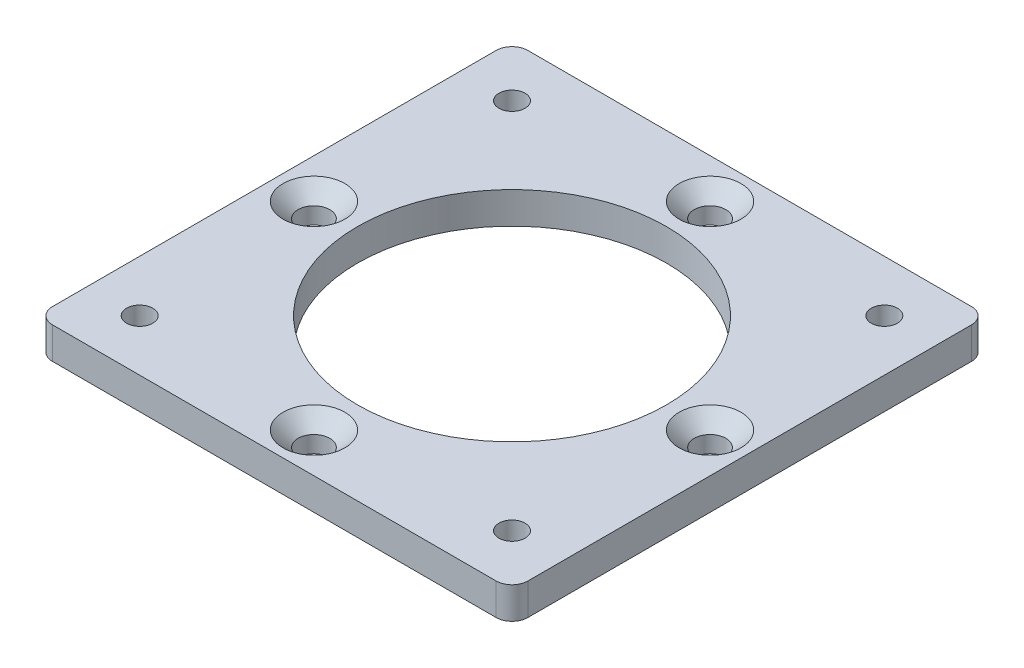
ISO-10303-21;
HEADER;
FILE_DESCRIPTION(('STEP AP214'),'2;1');
FILE_NAME('part.step','',(''),(''),'','','');
FILE_SCHEMA(('AUTOMOTIVE_DESIGN { 1 0 10303 214 1 1 1 1 }'));
ENDSEC;
DATA;
#1=APPLICATION_CONTEXT('core data for automotive mechanical design processes');
#2=APPLICATION_PROTOCOL_DEFINITION('international standard','automotive_design',2000,#1);
#3=PRODUCT_CONTEXT('',#1,'mechanical');
#4=PRODUCT('Part','Part','',(#3));
#5=PRODUCT_RELATED_PRODUCT_CATEGORY('part','',(#4));
#6=PRODUCT_DEFINITION_FORMATION('','',#4);
#7=PRODUCT_DEFINITION_CONTEXT('part definition',#1,'design');
#8=PRODUCT_DEFINITION('design','',#6,#7);
#9=PRODUCT_DEFINITION_SHAPE('','',#8);
#10=(LENGTH_UNIT() NAMED_UNIT(*) SI_UNIT(.MILLI.,.METRE.));
#11=(NAMED_UNIT(*) PLANE_ANGLE_UNIT() SI_UNIT($,.RADIAN.));
#12=(NAMED_UNIT(*) SI_UNIT($,.STERADIAN.) SOLID_ANGLE_UNIT());
#13=UNCERTAINTY_MEASURE_WITH_UNIT(LENGTH_MEASURE(1.E-05),#10,'distance_accuracy_value','');
#14=(GEOMETRIC_REPRESENTATION_CONTEXT(3) GLOBAL_UNCERTAINTY_ASSIGNED_CONTEXT((#13)) GLOBAL_UNIT_ASSIGNED_CONTEXT((#10,
#11,#12)) REPRESENTATION_CONTEXT('',''));
#15=CARTESIAN_POINT('',(0.,0.,0.));
#16=DIRECTION('',(0.,0.,1.));
#17=DIRECTION('',(1.,0.,0.));
#18=AXIS2_PLACEMENT_3D('',#15,#16,#17);
#19=CARTESIAN_POINT('',(-39.0949031250912,4.,26.2189672025911));
#20=DIRECTION('',(0.,1.,0.));
#21=DIRECTION('',(0.,0.,1.));
#22=AXIS2_PLACEMENT_3D('',#19,#20,#21);
#23=PLANE('',#22);
#24=CARTESIAN_POINT('',(-34.0949031250912,4.,-3.78103279740888));
#25=DIRECTION('',(0.,1.,0.));
#26=DIRECTION('',(0.,0.,1.));
#27=AXIS2_PLACEMENT_3D('',#24,#25,#26);
#28=CIRCLE('',#27,3.90000000000001);
#29=CARTESIAN_POINT('',(-34.0949031250912,4.,0.118967202591129));
#30=VERTEX_POINT('',#29);
#31=EDGE_CURVE('E179',#30,#30,#28,.F.);
#32=ORIENTED_EDGE('',*,*,#31,.T.);
#33=EDGE_LOOP('',(#32));
#34=FACE_BOUND('',#33,.T.);
#35=CARTESIAN_POINT('',(15.9050968749088,4.,-3.78103279740888));
#36=DIRECTION('',(0.,1.,0.));
#37=DIRECTION('',(0.,0.,1.));
#38=AXIS2_PLACEMENT_3D('',#35,#36,#37);
#39=CIRCLE('',#38,3.90000000000001);
#40=CARTESIAN_POINT('',(15.9050968749088,4.,0.118967202591129));
#41=VERTEX_POINT('',#40);
#42=EDGE_CURVE('E176',#41,#41,#39,.F.);
#43=ORIENTED_EDGE('',*,*,#42,.T.);
#44=EDGE_LOOP('',(#43));
#45=FACE_BOUND('',#44,.T.);
#46=CARTESIAN_POINT('',(-9.09490312509118,4.,21.2189672025911));
#47=DIRECTION('',(0.,1.,0.));
#48=DIRECTION('',(0.,0.,1.));
#49=AXIS2_PLACEMENT_3D('',#46,#47,#48);
#50=CIRCLE('',#49,3.90000000000001);
#51=CARTESIAN_POINT('',(-9.09490312509118,4.,25.1189672025911));
#52=VERTEX_POINT('',#51);
#53=EDGE_CURVE('E173',#52,#52,#50,.F.);
#54=ORIENTED_EDGE('',*,*,#53,.T.);
#55=EDGE_LOOP('',(#54));
#56=FACE_BOUND('',#55,.T.);
#57=CARTESIAN_POINT('',(-9.09490312509118,4.,-28.7810327974089));
#58=DIRECTION('',(0.,1.,0.));
#59=DIRECTION('',(0.,0.,1.));
#60=AXIS2_PLACEMENT_3D('',#57,#58,#59);
#61=CIRCLE('',#60,3.9);
#62=CARTESIAN_POINT('',(-9.09490312509118,4.,-24.8810327974089));
#63=VERTEX_POINT('',#62);
#64=EDGE_CURVE('E170',#63,#63,#61,.F.);
#65=ORIENTED_EDGE('',*,*,#64,.T.);
#66=EDGE_LOOP('',(#65));
#67=FACE_BOUND('',#66,.T.);
#68=CARTESIAN_POINT('',(14.4050968749088,4.,19.7189672025911));
#69=DIRECTION('',(0.,1.,0.));
#70=DIRECTION('',(0.,0.,1.));
#71=AXIS2_PLACEMENT_3D('',#68,#69,#70);
#72=CIRCLE('',#71,1.65);
#73=CARTESIAN_POINT('',(14.4050968749088,4.,21.3689672025911));
#74=VERTEX_POINT('',#73);
#75=EDGE_CURVE('E276',#74,#74,#72,.T.);
#76=ORIENTED_EDGE('',*,*,#75,.F.);
#77=EDGE_LOOP('',(#76));
#78=FACE_BOUND('',#77,.T.);
#79=CARTESIAN_POINT('',(14.4050968749088,4.,-27.2810327974089));
#80=DIRECTION('',(0.,1.,0.));
#81=DIRECTION('',(0.,0.,1.));
#82=AXIS2_PLACEMENT_3D('',#79,#80,#81);
#83=CIRCLE('',#82,1.65);
#84=CARTESIAN_POINT('',(14.4050968749088,4.,-25.6310327974089));
#85=VERTEX_POINT('',#84);
#86=EDGE_CURVE('E288',#85,#85,#83,.T.);
#87=ORIENTED_EDGE('',*,*,#86,.F.);
#88=EDGE_LOOP('',(#87));
#89=FACE_BOUND('',#88,.T.);
#90=DIRECTION('',(-1.,0.,0.));
#91=VECTOR('',#90,1.);
#92=CARTESIAN_POINT('',(-39.0949031250912,4.,-33.7810327974089));
#93=LINE('',#92,#91);
#94=CARTESIAN_POINT('',(18.9050968749088,4.,-33.7810327974089));
#95=VERTEX_POINT('',#94);
#96=CARTESIAN_POINT('',(-37.0949031250912,4.,-33.7810327974089));
#97=VERTEX_POINT('',#96);
#98=EDGE_CURVE('E137',#95,#97,#93,.T.);
#99=ORIENTED_EDGE('',*,*,#98,.T.);
#100=CARTESIAN_POINT('',(-37.0949031250912,4.,-31.7810327974089));
#101=DIRECTION('',(0.,1.,0.));
#102=DIRECTION('',(0.,0.,1.));
#103=AXIS2_PLACEMENT_3D('',#100,#101,#102);
#104=CIRCLE('',#103,2.);
#105=CARTESIAN_POINT('',(-39.0949031250912,4.,-31.7810327974089));
#106=VERTEX_POINT('',#105);
#107=EDGE_CURVE('E156',#97,#106,#104,.T.);
#108=ORIENTED_EDGE('',*,*,#107,.T.);
#109=DIRECTION('',(0.,0.,1.));
#110=VECTOR('',#109,1.);
#111=CARTESIAN_POINT('',(-39.0949031250912,4.,-33.7810327974089));
#112=LINE('',#111,#110);
#113=CARTESIAN_POINT('',(-39.0949031250912,4.,24.2189672025911));
#114=VERTEX_POINT('',#113);
#115=EDGE_CURVE('E120',#106,#114,#112,.T.);
#116=ORIENTED_EDGE('',*,*,#115,.T.);
#117=CARTESIAN_POINT('',(-37.0949031250912,4.,24.2189672025911));
#118=DIRECTION('',(0.,1.,0.));
#119=DIRECTION('',(0.,0.,1.));
#120=AXIS2_PLACEMENT_3D('',#117,#118,#119);
#121=CIRCLE('',#120,2.);
#122=CARTESIAN_POINT('',(-37.0949031250912,4.,26.2189672025911));
#123=VERTEX_POINT('',#122);
#124=EDGE_CURVE('E151',#114,#123,#121,.T.);
#125=ORIENTED_EDGE('',*,*,#124,.T.);
#126=DIRECTION('',(1.,0.,0.));
#127=VECTOR('',#126,1.);
#128=CARTESIAN_POINT('',(-39.0949031250912,4.,26.2189672025911));
#129=LINE('',#128,#127);
#130=CARTESIAN_POINT('',(18.9050968749088,4.,26.2189672025911));
#131=VERTEX_POINT('',#130);
#132=EDGE_CURVE('E296',#123,#131,#129,.T.);
#133=ORIENTED_EDGE('',*,*,#132,.T.);
#134=CARTESIAN_POINT('',(18.9050968749088,4.,24.2189672025911));
#135=DIRECTION('',(0.,1.,0.));
#136=DIRECTION('',(0.,0.,1.));
#137=AXIS2_PLACEMENT_3D('',#134,#135,#136);
#138=CIRCLE('',#137,2.);
#139=CARTESIAN_POINT('',(20.9050968749088,4.,24.2189672025911));
#140=VERTEX_POINT('',#139);
#141=EDGE_CURVE('E55',#131,#140,#138,.T.);
#142=ORIENTED_EDGE('',*,*,#141,.T.);
#143=DIRECTION('',(0.,0.,-1.));
#144=VECTOR('',#143,1.);
#145=CARTESIAN_POINT('',(20.9050968749088,4.,-33.7810327974089));
#146=LINE('',#145,#144);
#147=CARTESIAN_POINT('',(20.9050968749088,4.,-31.7810327974089));
#148=VERTEX_POINT('',#147);
#149=EDGE_CURVE('E297',#140,#148,#146,.T.);
#150=ORIENTED_EDGE('',*,*,#149,.T.);
#151=CARTESIAN_POINT('',(18.9050968749088,4.,-31.7810327974089));
#152=DIRECTION('',(0.,1.,0.));
#153=DIRECTION('',(0.,0.,1.));
#154=AXIS2_PLACEMENT_3D('',#151,#152,#153);
#155=CIRCLE('',#154,2.);
#156=EDGE_CURVE('E154',#148,#95,#155,.T.);
#157=ORIENTED_EDGE('',*,*,#156,.T.);
#158=EDGE_LOOP('',(#99,#108,#116,#125,#133,#142,#150,#157));
#159=FACE_BOUND('',#158,.T.);
#160=CARTESIAN_POINT('',(-32.5949031250912,4.,-27.2810327974089));
#161=DIRECTION('',(0.,1.,0.));
#162=DIRECTION('',(0.,0.,1.));
#163=AXIS2_PLACEMENT_3D('',#160,#161,#162);
#164=CIRCLE('',#163,1.65);
#165=CARTESIAN_POINT('',(-32.5949031250912,4.,-25.6310327974089));
#166=VERTEX_POINT('',#165);
#167=EDGE_CURVE('E128',#166,#166,#164,.T.);
#168=ORIENTED_EDGE('',*,*,#167,.F.);
#169=EDGE_LOOP('',(#168));
#170=FACE_BOUND('',#169,.T.);
#171=CARTESIAN_POINT('',(-32.5949031250912,4.,19.7189672025911));
#172=DIRECTION('',(0.,1.,0.));
#173=DIRECTION('',(0.,0.,1.));
#174=AXIS2_PLACEMENT_3D('',#171,#172,#173);
#175=CIRCLE('',#174,1.65);
#176=CARTESIAN_POINT('',(-32.5949031250912,4.,21.3689672025911));
#177=VERTEX_POINT('',#176);
#178=EDGE_CURVE('E282',#177,#177,#175,.T.);
#179=ORIENTED_EDGE('',*,*,#178,.F.);
#180=EDGE_LOOP('',(#179));
#181=FACE_BOUND('',#180,.T.);
#182=CARTESIAN_POINT('',(-9.09490312509118,4.,-3.78103279740888));
#183=DIRECTION('',(0.,1.,0.));
#184=DIRECTION('',(0.,0.,1.));
#185=AXIS2_PLACEMENT_3D('',#182,#183,#184);
#186=CIRCLE('',#185,19.5);
#187=CARTESIAN_POINT('',(-9.09490312509118,4.,15.7189672025911));
#188=VERTEX_POINT('',#187);
#189=EDGE_CURVE('E266',#188,#188,#186,.T.);
#190=ORIENTED_EDGE('',*,*,#189,.F.);
#191=EDGE_LOOP('',(#190));
#192=FACE_BOUND('',#191,.T.);
#193=ADVANCED_FACE('F33',(#34,#45,#56,#67,#78,#89,#159,#170,#181,#192),#23,.T.);
#194=CARTESIAN_POINT('',(-39.0949031250912,0.,26.2189672025911));
#195=DIRECTION('',(0.,1.,0.));
#196=DIRECTION('',(0.,0.,1.));
#197=AXIS2_PLACEMENT_3D('',#194,#195,#196);
#198=PLANE('',#197);
#199=CARTESIAN_POINT('',(-9.09490312509118,0.,-28.7810327974089));
#200=DIRECTION('',(0.,1.,0.));
#201=DIRECTION('',(0.,0.,1.));
#202=AXIS2_PLACEMENT_3D('',#199,#200,#201);
#203=CIRCLE('',#202,2.);
#204=CARTESIAN_POINT('',(-9.09490312509118,0.,-26.7810327974089));
#205=VERTEX_POINT('',#204);
#206=EDGE_CURVE('E269',#205,#205,#203,.T.);
#207=ORIENTED_EDGE('',*,*,#206,.T.);
#208=EDGE_LOOP('',(#207));
#209=FACE_BOUND('',#208,.T.);
#210=CARTESIAN_POINT('',(-34.0949031250912,0.,-3.78103279740888));
#211=DIRECTION('',(0.,1.,0.));
#212=DIRECTION('',(0.,0.,1.));
#213=AXIS2_PLACEMENT_3D('',#210,#211,#212);
#214=CIRCLE('',#213,2.);
#215=CARTESIAN_POINT('',(-34.0949031250912,0.,-1.78103279740888));
#216=VERTEX_POINT('',#215);
#217=EDGE_CURVE('E260',#216,#216,#214,.T.);
#218=ORIENTED_EDGE('',*,*,#217,.T.);
#219=EDGE_LOOP('',(#218));
#220=FACE_BOUND('',#219,.T.);
#221=CARTESIAN_POINT('',(14.4050968749088,0.,19.7189672025911));
#222=DIRECTION('',(0.,1.,0.));
#223=DIRECTION('',(0.,0.,1.));
#224=AXIS2_PLACEMENT_3D('',#221,#222,#223);
#225=CIRCLE('',#224,1.65);
#226=CARTESIAN_POINT('',(14.4050968749088,0.,21.3689672025911));
#227=VERTEX_POINT('',#226);
#228=EDGE_CURVE('E274',#227,#227,#225,.T.);
#229=ORIENTED_EDGE('',*,*,#228,.T.);
#230=EDGE_LOOP('',(#229));
#231=FACE_BOUND('',#230,.T.);
#232=CARTESIAN_POINT('',(14.4050968749088,0.,-27.2810327974089));
#233=DIRECTION('',(0.,1.,0.));
#234=DIRECTION('',(0.,0.,1.));
#235=AXIS2_PLACEMENT_3D('',#232,#233,#234);
#236=CIRCLE('',#235,1.65);
#237=CARTESIAN_POINT('',(14.4050968749088,0.,-25.6310327974089));
#238=VERTEX_POINT('',#237);
#239=EDGE_CURVE('E285',#238,#238,#236,.T.);
#240=ORIENTED_EDGE('',*,*,#239,.T.);
#241=EDGE_LOOP('',(#240));
#242=FACE_BOUND('',#241,.T.);
#243=DIRECTION('',(0.,0.,1.));
#244=VECTOR('',#243,1.);
#245=CARTESIAN_POINT('',(-39.0949031250912,0.,-33.7810327974089));
#246=LINE('',#245,#244);
#247=CARTESIAN_POINT('',(-39.0949031250912,0.,-31.7810327974089));
#248=VERTEX_POINT('',#247);
#249=CARTESIAN_POINT('',(-39.0949031250912,0.,24.2189672025911));
#250=VERTEX_POINT('',#249);
#251=EDGE_CURVE('E117',#248,#250,#246,.T.);
#252=ORIENTED_EDGE('',*,*,#251,.F.);
#253=CARTESIAN_POINT('',(-37.0949031250912,0.,-31.7810327974089));
#254=DIRECTION('',(0.,1.,0.));
#255=DIRECTION('',(0.,0.,1.));
#256=AXIS2_PLACEMENT_3D('',#253,#254,#255);
#257=CIRCLE('',#256,2.);
#258=CARTESIAN_POINT('',(-37.0949031250912,0.,-33.7810327974089));
#259=VERTEX_POINT('',#258);
#260=EDGE_CURVE('E100',#248,#259,#257,.F.);
#261=ORIENTED_EDGE('',*,*,#260,.T.);
#262=DIRECTION('',(-1.,0.,0.));
#263=VECTOR('',#262,1.);
#264=CARTESIAN_POINT('',(-39.0949031250912,0.,-33.7810327974089));
#265=LINE('',#264,#263);
#266=CARTESIAN_POINT('',(18.9050968749088,0.,-33.7810327974089));
#267=VERTEX_POINT('',#266);
#268=EDGE_CURVE('E141',#267,#259,#265,.T.);
#269=ORIENTED_EDGE('',*,*,#268,.F.);
#270=CARTESIAN_POINT('',(18.9050968749088,0.,-31.7810327974089));
#271=DIRECTION('',(0.,1.,0.));
#272=DIRECTION('',(0.,0.,1.));
#273=AXIS2_PLACEMENT_3D('',#270,#271,#272);
#274=CIRCLE('',#273,2.);
#275=CARTESIAN_POINT('',(20.9050968749088,0.,-31.7810327974089));
#276=VERTEX_POINT('',#275);
#277=EDGE_CURVE('E111',#267,#276,#274,.F.);
#278=ORIENTED_EDGE('',*,*,#277,.T.);
#279=DIRECTION('',(0.,0.,-1.));
#280=VECTOR('',#279,1.);
#281=CARTESIAN_POINT('',(20.9050968749088,0.,-33.7810327974089));
#282=LINE('',#281,#280);
#283=CARTESIAN_POINT('',(20.9050968749088,0.,24.2189672025911));
#284=VERTEX_POINT('',#283);
#285=EDGE_CURVE('E131',#284,#276,#282,.T.);
#286=ORIENTED_EDGE('',*,*,#285,.F.);
#287=CARTESIAN_POINT('',(18.9050968749088,0.,24.2189672025911));
#288=DIRECTION('',(0.,1.,0.));
#289=DIRECTION('',(0.,0.,1.));
#290=AXIS2_PLACEMENT_3D('',#287,#288,#289);
#291=CIRCLE('',#290,2.);
#292=CARTESIAN_POINT('',(18.9050968749088,0.,26.2189672025911));
#293=VERTEX_POINT('',#292);
#294=EDGE_CURVE('E145',#284,#293,#291,.F.);
#295=ORIENTED_EDGE('',*,*,#294,.T.);
#296=DIRECTION('',(1.,0.,0.));
#297=VECTOR('',#296,1.);
#298=CARTESIAN_POINT('',(-39.0949031250912,0.,26.2189672025911));
#299=LINE('',#298,#297);
#300=CARTESIAN_POINT('',(-37.0949031250912,0.,26.2189672025911));
#301=VERTEX_POINT('',#300);
#302=EDGE_CURVE('E127',#301,#293,#299,.T.);
#303=ORIENTED_EDGE('',*,*,#302,.F.);
#304=CARTESIAN_POINT('',(-37.0949031250912,0.,24.2189672025911));
#305=DIRECTION('',(0.,1.,0.));
#306=DIRECTION('',(0.,0.,1.));
#307=AXIS2_PLACEMENT_3D('',#304,#305,#306);
#308=CIRCLE('',#307,2.);
#309=EDGE_CURVE('E121',#301,#250,#308,.F.);
#310=ORIENTED_EDGE('',*,*,#309,.T.);
#311=EDGE_LOOP('',(#252,#261,#269,#278,#286,#295,#303,#310));
#312=FACE_BOUND('',#311,.T.);
#313=CARTESIAN_POINT('',(-32.5949031250912,0.,-27.2810327974089));
#314=DIRECTION('',(0.,1.,0.));
#315=DIRECTION('',(0.,0.,1.));
#316=AXIS2_PLACEMENT_3D('',#313,#314,#315);
#317=CIRCLE('',#316,1.65);
#318=CARTESIAN_POINT('',(-32.5949031250912,0.,-25.6310327974089));
#319=VERTEX_POINT('',#318);
#320=EDGE_CURVE('E134',#319,#319,#317,.T.);
#321=ORIENTED_EDGE('',*,*,#320,.T.);
#322=EDGE_LOOP('',(#321));
#323=FACE_BOUND('',#322,.T.);
#324=CARTESIAN_POINT('',(-32.5949031250912,0.,19.7189672025911));
#325=DIRECTION('',(0.,1.,0.));
#326=DIRECTION('',(0.,0.,1.));
#327=AXIS2_PLACEMENT_3D('',#324,#325,#326);
#328=CIRCLE('',#327,1.65);
#329=CARTESIAN_POINT('',(-32.5949031250912,0.,21.3689672025911));
#330=VERTEX_POINT('',#329);
#331=EDGE_CURVE('E279',#330,#330,#328,.T.);
#332=ORIENTED_EDGE('',*,*,#331,.T.);
#333=EDGE_LOOP('',(#332));
#334=FACE_BOUND('',#333,.T.);
#335=CARTESIAN_POINT('',(-9.09490312509118,0.,-3.78103279740888));
#336=DIRECTION('',(0.,1.,0.));
#337=DIRECTION('',(0.,0.,1.));
#338=AXIS2_PLACEMENT_3D('',#335,#336,#337);
#339=CIRCLE('',#338,19.5);
#340=CARTESIAN_POINT('',(-9.09490312509118,0.,15.7189672025911));
#341=VERTEX_POINT('',#340);
#342=EDGE_CURVE('E262',#341,#341,#339,.T.);
#343=ORIENTED_EDGE('',*,*,#342,.T.);
#344=EDGE_LOOP('',(#343));
#345=FACE_BOUND('',#344,.T.);
#346=CARTESIAN_POINT('',(15.9050968749088,0.,-3.78103279740888));
#347=DIRECTION('',(0.,1.,0.));
#348=DIRECTION('',(0.,0.,1.));
#349=AXIS2_PLACEMENT_3D('',#346,#347,#348);
#350=CIRCLE('',#349,2.);
#351=CARTESIAN_POINT('',(15.9050968749088,0.,-1.78103279740888));
#352=VERTEX_POINT('',#351);
#353=EDGE_CURVE('E263',#352,#352,#350,.T.);
#354=ORIENTED_EDGE('',*,*,#353,.T.);
#355=EDGE_LOOP('',(#354));
#356=FACE_BOUND('',#355,.T.);
#357=CARTESIAN_POINT('',(-9.09490312509118,0.,21.2189672025911));
#358=DIRECTION('',(0.,1.,0.));
#359=DIRECTION('',(0.,0.,1.));
#360=AXIS2_PLACEMENT_3D('',#357,#358,#359);
#361=CIRCLE('',#360,2.);
#362=CARTESIAN_POINT('',(-9.09490312509118,0.,23.2189672025911));
#363=VERTEX_POINT('',#362);
#364=EDGE_CURVE('E326',#363,#363,#361,.T.);
#365=ORIENTED_EDGE('',*,*,#364,.T.);
#366=EDGE_LOOP('',(#365));
#367=FACE_BOUND('',#366,.T.);
#368=ADVANCED_FACE('F124',(#209,#220,#231,#242,#312,#323,#334,#345,#356,#367),#198,.F.);
#369=CARTESIAN_POINT('',(-39.0949031250912,4.,-33.7810327974089));
#370=DIRECTION('',(1.,0.,0.));
#371=DIRECTION('',(0.,0.,-1.));
#372=AXIS2_PLACEMENT_3D('',#369,#370,#371);
#373=PLANE('',#372);
#374=ORIENTED_EDGE('',*,*,#115,.F.);
#375=DIRECTION('',(0.,-1.,0.));
#376=VECTOR('',#375,1.);
#377=CARTESIAN_POINT('',(-39.0949031250912,4.,-31.7810327974089));
#378=LINE('',#377,#376);
#379=EDGE_CURVE('E104',#106,#248,#378,.T.);
#380=ORIENTED_EDGE('',*,*,#379,.T.);
#381=ORIENTED_EDGE('',*,*,#251,.T.);
#382=DIRECTION('',(0.,-1.,0.));
#383=VECTOR('',#382,1.);
#384=CARTESIAN_POINT('',(-39.0949031250912,4.,24.2189672025911));
#385=LINE('',#384,#383);
#386=EDGE_CURVE('E122',#250,#114,#385,.F.);
#387=ORIENTED_EDGE('',*,*,#386,.T.);
#388=EDGE_LOOP('',(#374,#380,#381,#387));
#389=FACE_BOUND('',#388,.T.);
#390=ADVANCED_FACE('F116',(#389),#373,.F.);
#391=CARTESIAN_POINT('',(-39.0949031250912,4.,26.2189672025911));
#392=DIRECTION('',(0.,0.,-1.));
#393=DIRECTION('',(-1.,0.,0.));
#394=AXIS2_PLACEMENT_3D('',#391,#392,#393);
#395=PLANE('',#394);
#396=ORIENTED_EDGE('',*,*,#302,.T.);
#397=DIRECTION('',(0.,-1.,0.));
#398=VECTOR('',#397,1.);
#399=CARTESIAN_POINT('',(18.9050968749088,4.,26.2189672025911));
#400=LINE('',#399,#398);
#401=EDGE_CURVE('E165',#293,#131,#400,.F.);
#402=ORIENTED_EDGE('',*,*,#401,.T.);
#403=ORIENTED_EDGE('',*,*,#132,.F.);
#404=DIRECTION('',(0.,-1.,0.));
#405=VECTOR('',#404,1.);
#406=CARTESIAN_POINT('',(-37.0949031250912,4.,26.2189672025911));
#407=LINE('',#406,#405);
#408=EDGE_CURVE('E162',#123,#301,#407,.T.);
#409=ORIENTED_EDGE('',*,*,#408,.T.);
#410=EDGE_LOOP('',(#396,#402,#403,#409));
#411=FACE_BOUND('',#410,.T.);
#412=ADVANCED_FACE('F225',(#411),#395,.F.);
#413=CARTESIAN_POINT('',(20.9050968749088,4.,-33.7810327974089));
#414=DIRECTION('',(-1.,0.,0.));
#415=DIRECTION('',(0.,0.,1.));
#416=AXIS2_PLACEMENT_3D('',#413,#414,#415);
#417=PLANE('',#416);
#418=ORIENTED_EDGE('',*,*,#285,.T.);
#419=DIRECTION('',(0.,-1.,0.));
#420=VECTOR('',#419,1.);
#421=CARTESIAN_POINT('',(20.9050968749088,4.,-31.7810327974089));
#422=LINE('',#421,#420);
#423=EDGE_CURVE('E48',#276,#148,#422,.F.);
#424=ORIENTED_EDGE('',*,*,#423,.T.);
#425=ORIENTED_EDGE('',*,*,#149,.F.);
#426=DIRECTION('',(0.,-1.,0.));
#427=VECTOR('',#426,1.);
#428=CARTESIAN_POINT('',(20.9050968749088,4.,24.2189672025911));
#429=LINE('',#428,#427);
#430=EDGE_CURVE('E158',#140,#284,#429,.T.);
#431=ORIENTED_EDGE('',*,*,#430,.T.);
#432=EDGE_LOOP('',(#418,#424,#425,#431));
#433=FACE_BOUND('',#432,.T.);
#434=ADVANCED_FACE('F221',(#433),#417,.F.);
#435=CARTESIAN_POINT('',(-39.0949031250912,4.,-33.7810327974089));
#436=DIRECTION('',(0.,0.,1.));
#437=DIRECTION('',(1.,0.,0.));
#438=AXIS2_PLACEMENT_3D('',#435,#436,#437);
#439=PLANE('',#438);
#440=ORIENTED_EDGE('',*,*,#268,.T.);
#441=DIRECTION('',(0.,-1.,0.));
#442=VECTOR('',#441,1.);
#443=CARTESIAN_POINT('',(-37.0949031250912,4.,-33.7810327974089));
#444=LINE('',#443,#442);
#445=EDGE_CURVE('E105',#259,#97,#444,.F.);
#446=ORIENTED_EDGE('',*,*,#445,.T.);
#447=ORIENTED_EDGE('',*,*,#98,.F.);
#448=DIRECTION('',(0.,-1.,0.));
#449=VECTOR('',#448,1.);
#450=CARTESIAN_POINT('',(18.9050968749088,4.,-33.7810327974089));
#451=LINE('',#450,#449);
#452=EDGE_CURVE('E110',#95,#267,#451,.T.);
#453=ORIENTED_EDGE('',*,*,#452,.T.);
#454=EDGE_LOOP('',(#440,#446,#447,#453));
#455=FACE_BOUND('',#454,.T.);
#456=ADVANCED_FACE('F218',(#455),#439,.F.);
#457=CARTESIAN_POINT('',(-32.5949031250912,4.,-27.2810327974089));
#458=DIRECTION('',(0.,-1.,0.));
#459=DIRECTION('',(0.,0.,-1.));
#460=AXIS2_PLACEMENT_3D('',#457,#458,#459);
#461=CYLINDRICAL_SURFACE('',#460,1.65);
#462=ORIENTED_EDGE('',*,*,#167,.T.);
#463=EDGE_LOOP('',(#462));
#464=FACE_BOUND('',#463,.T.);
#465=ORIENTED_EDGE('',*,*,#320,.F.);
#466=EDGE_LOOP('',(#465));
#467=FACE_BOUND('',#466,.T.);
#468=ADVANCED_FACE('F215',(#464,#467),#461,.F.);
#469=CARTESIAN_POINT('',(14.4050968749088,4.,-27.2810327974089));
#470=DIRECTION('',(0.,-1.,0.));
#471=DIRECTION('',(0.,0.,-1.));
#472=AXIS2_PLACEMENT_3D('',#469,#470,#471);
#473=CYLINDRICAL_SURFACE('',#472,1.65);
#474=ORIENTED_EDGE('',*,*,#86,.T.);
#475=EDGE_LOOP('',(#474));
#476=FACE_BOUND('',#475,.T.);
#477=ORIENTED_EDGE('',*,*,#239,.F.);
#478=EDGE_LOOP('',(#477));
#479=FACE_BOUND('',#478,.T.);
#480=ADVANCED_FACE('F348',(#476,#479),#473,.F.);
#481=CARTESIAN_POINT('',(-32.5949031250912,4.,19.7189672025911));
#482=DIRECTION('',(0.,-1.,0.));
#483=DIRECTION('',(0.,0.,-1.));
#484=AXIS2_PLACEMENT_3D('',#481,#482,#483);
#485=CYLINDRICAL_SURFACE('',#484,1.65);
#486=ORIENTED_EDGE('',*,*,#178,.T.);
#487=EDGE_LOOP('',(#486));
#488=FACE_BOUND('',#487,.T.);
#489=ORIENTED_EDGE('',*,*,#331,.F.);
#490=EDGE_LOOP('',(#489));
#491=FACE_BOUND('',#490,.T.);
#492=ADVANCED_FACE('F345',(#488,#491),#485,.F.);
#493=CARTESIAN_POINT('',(14.4050968749088,4.,19.7189672025911));
#494=DIRECTION('',(0.,-1.,0.));
#495=DIRECTION('',(0.,0.,-1.));
#496=AXIS2_PLACEMENT_3D('',#493,#494,#495);
#497=CYLINDRICAL_SURFACE('',#496,1.65);
#498=ORIENTED_EDGE('',*,*,#75,.T.);
#499=EDGE_LOOP('',(#498));
#500=FACE_BOUND('',#499,.T.);
#501=ORIENTED_EDGE('',*,*,#228,.F.);
#502=EDGE_LOOP('',(#501));
#503=FACE_BOUND('',#502,.T.);
#504=ADVANCED_FACE('F317',(#500,#503),#497,.F.);
#505=CARTESIAN_POINT('',(-9.09490312509118,4.,-3.78103279740888));
#506=DIRECTION('',(0.,-1.,0.));
#507=DIRECTION('',(0.,0.,-1.));
#508=AXIS2_PLACEMENT_3D('',#505,#506,#507);
#509=CYLINDRICAL_SURFACE('',#508,19.5);
#510=ORIENTED_EDGE('',*,*,#189,.T.);
#511=EDGE_LOOP('',(#510));
#512=FACE_BOUND('',#511,.T.);
#513=ORIENTED_EDGE('',*,*,#342,.F.);
#514=EDGE_LOOP('',(#513));
#515=FACE_BOUND('',#514,.T.);
#516=ADVANCED_FACE('F256',(#512,#515),#509,.F.);
#517=CARTESIAN_POINT('',(-34.0949031250912,4.,-3.78103279740888));
#518=DIRECTION('',(0.,-1.,0.));
#519=DIRECTION('',(0.,0.,-1.));
#520=AXIS2_PLACEMENT_3D('',#517,#518,#519);
#521=CYLINDRICAL_SURFACE('',#520,2.);
#522=CARTESIAN_POINT('',(-34.0949031250912,2.09999999999999,-3.78103279740888));
#523=DIRECTION('',(0.,1.,0.));
#524=DIRECTION('',(0.,0.,1.));
#525=AXIS2_PLACEMENT_3D('',#522,#523,#524);
#526=CIRCLE('',#525,2.);
#527=CARTESIAN_POINT('',(-34.0949031250912,2.09999999999999,-1.78103279740888));
#528=VERTEX_POINT('',#527);
#529=EDGE_CURVE('E167',#528,#528,#526,.T.);
#530=ORIENTED_EDGE('',*,*,#529,.T.);
#531=EDGE_LOOP('',(#530));
#532=FACE_BOUND('',#531,.T.);
#533=ORIENTED_EDGE('',*,*,#217,.F.);
#534=EDGE_LOOP('',(#533));
#535=FACE_BOUND('',#534,.T.);
#536=ADVANCED_FACE('F253',(#532,#535),#521,.F.);
#537=CARTESIAN_POINT('',(15.9050968749088,4.,-3.78103279740888));
#538=DIRECTION('',(0.,-1.,0.));
#539=DIRECTION('',(0.,0.,-1.));
#540=AXIS2_PLACEMENT_3D('',#537,#538,#539);
#541=CYLINDRICAL_SURFACE('',#540,2.);
#542=CARTESIAN_POINT('',(15.9050968749088,2.09999999999999,-3.78103279740888));
#543=DIRECTION('',(0.,1.,0.));
#544=DIRECTION('',(0.,0.,1.));
#545=AXIS2_PLACEMENT_3D('',#542,#543,#544);
#546=CIRCLE('',#545,2.);
#547=CARTESIAN_POINT('',(15.9050968749088,2.09999999999999,-1.78103279740888));
#548=VERTEX_POINT('',#547);
#549=EDGE_CURVE('E182',#548,#548,#546,.T.);
#550=ORIENTED_EDGE('',*,*,#549,.T.);
#551=EDGE_LOOP('',(#550));
#552=FACE_BOUND('',#551,.T.);
#553=ORIENTED_EDGE('',*,*,#353,.F.);
#554=EDGE_LOOP('',(#553));
#555=FACE_BOUND('',#554,.T.);
#556=ADVANCED_FACE('F255',(#552,#555),#541,.F.);
#557=CARTESIAN_POINT('',(-9.09490312509118,4.,-28.7810327974089));
#558=DIRECTION('',(0.,-1.,0.));
#559=DIRECTION('',(0.,0.,-1.));
#560=AXIS2_PLACEMENT_3D('',#557,#558,#559);
#561=CYLINDRICAL_SURFACE('',#560,2.);
#562=CARTESIAN_POINT('',(-9.09490312509118,2.09999999999999,-28.7810327974089));
#563=DIRECTION('',(0.,1.,0.));
#564=DIRECTION('',(0.,0.,1.));
#565=AXIS2_PLACEMENT_3D('',#562,#563,#564);
#566=CIRCLE('',#565,2.);
#567=CARTESIAN_POINT('',(-9.09490312509118,2.09999999999999,-26.7810327974089));
#568=VERTEX_POINT('',#567);
#569=EDGE_CURVE('E11',#568,#568,#566,.T.);
#570=ORIENTED_EDGE('',*,*,#569,.T.);
#571=EDGE_LOOP('',(#570));
#572=FACE_BOUND('',#571,.T.);
#573=ORIENTED_EDGE('',*,*,#206,.F.);
#574=EDGE_LOOP('',(#573));
#575=FACE_BOUND('',#574,.T.);
#576=ADVANCED_FACE('F331',(#572,#575),#561,.F.);
#577=CARTESIAN_POINT('',(-9.09490312509118,4.,21.2189672025911));
#578=DIRECTION('',(0.,-1.,0.));
#579=DIRECTION('',(0.,0.,-1.));
#580=AXIS2_PLACEMENT_3D('',#577,#578,#579);
#581=CYLINDRICAL_SURFACE('',#580,2.);
#582=CARTESIAN_POINT('',(-9.09490312509118,2.09999999999999,21.2189672025911));
#583=DIRECTION('',(0.,1.,0.));
#584=DIRECTION('',(0.,0.,1.));
#585=AXIS2_PLACEMENT_3D('',#582,#583,#584);
#586=CIRCLE('',#585,2.);
#587=CARTESIAN_POINT('',(-9.09490312509118,2.09999999999999,23.2189672025911));
#588=VERTEX_POINT('',#587);
#589=EDGE_CURVE('E41',#588,#588,#586,.T.);
#590=ORIENTED_EDGE('',*,*,#589,.T.);
#591=EDGE_LOOP('',(#590));
#592=FACE_BOUND('',#591,.T.);
#593=ORIENTED_EDGE('',*,*,#364,.F.);
#594=EDGE_LOOP('',(#593));
#595=FACE_BOUND('',#594,.T.);
#596=ADVANCED_FACE('F187',(#592,#595),#581,.F.);
#597=CARTESIAN_POINT('',(-37.0949031250912,4.,-31.7810327974089));
#598=DIRECTION('',(0.,-1.,0.));
#599=DIRECTION('',(0.,0.,-1.));
#600=AXIS2_PLACEMENT_3D('',#597,#598,#599);
#601=CYLINDRICAL_SURFACE('',#600,2.);
#602=ORIENTED_EDGE('',*,*,#107,.F.);
#603=ORIENTED_EDGE('',*,*,#445,.F.);
#604=ORIENTED_EDGE('',*,*,#260,.F.);
#605=ORIENTED_EDGE('',*,*,#379,.F.);
#606=EDGE_LOOP('',(#602,#603,#604,#605));
#607=FACE_BOUND('',#606,.T.);
#608=ADVANCED_FACE('F103',(#607),#601,.T.);
#609=CARTESIAN_POINT('',(18.9050968749088,4.,-31.7810327974089));
#610=DIRECTION('',(0.,-1.,0.));
#611=DIRECTION('',(0.,0.,-1.));
#612=AXIS2_PLACEMENT_3D('',#609,#610,#611);
#613=CYLINDRICAL_SURFACE('',#612,2.);
#614=ORIENTED_EDGE('',*,*,#156,.F.);
#615=ORIENTED_EDGE('',*,*,#423,.F.);
#616=ORIENTED_EDGE('',*,*,#277,.F.);
#617=ORIENTED_EDGE('',*,*,#452,.F.);
#618=EDGE_LOOP('',(#614,#615,#616,#617));
#619=FACE_BOUND('',#618,.T.);
#620=ADVANCED_FACE('F233',(#619),#613,.T.);
#621=CARTESIAN_POINT('',(18.9050968749088,4.,24.2189672025911));
#622=DIRECTION('',(0.,-1.,0.));
#623=DIRECTION('',(0.,0.,-1.));
#624=AXIS2_PLACEMENT_3D('',#621,#622,#623);
#625=CYLINDRICAL_SURFACE('',#624,2.);
#626=ORIENTED_EDGE('',*,*,#141,.F.);
#627=ORIENTED_EDGE('',*,*,#401,.F.);
#628=ORIENTED_EDGE('',*,*,#294,.F.);
#629=ORIENTED_EDGE('',*,*,#430,.F.);
#630=EDGE_LOOP('',(#626,#627,#628,#629));
#631=FACE_BOUND('',#630,.T.);
#632=ADVANCED_FACE('F236',(#631),#625,.T.);
#633=CARTESIAN_POINT('',(-37.0949031250912,4.,24.2189672025911));
#634=DIRECTION('',(0.,-1.,0.));
#635=DIRECTION('',(0.,0.,-1.));
#636=AXIS2_PLACEMENT_3D('',#633,#634,#635);
#637=CYLINDRICAL_SURFACE('',#636,2.);
#638=ORIENTED_EDGE('',*,*,#124,.F.);
#639=ORIENTED_EDGE('',*,*,#386,.F.);
#640=ORIENTED_EDGE('',*,*,#309,.F.);
#641=ORIENTED_EDGE('',*,*,#408,.F.);
#642=EDGE_LOOP('',(#638,#639,#640,#641));
#643=FACE_BOUND('',#642,.T.);
#644=ADVANCED_FACE('F240',(#643),#637,.T.);
#645=CARTESIAN_POINT('',(-34.0949031250912,2.09999999999999,-3.78103279740888));
#646=DIRECTION('',(0.,1.,0.));
#647=DIRECTION('',(0.,0.,1.));
#648=AXIS2_PLACEMENT_3D('',#645,#646,#647);
#649=CONICAL_SURFACE('',#648,2.,0.785398163397446);
#650=CARTESIAN_POINT('',(-34.0949031250912,4.,0.118967202591129));
#651=CARTESIAN_POINT('',(-34.0949031250912,3.98020833333333,0.0991755359244619));
#652=CARTESIAN_POINT('',(-34.0949031250912,3.96041666666667,0.0793838692577953));
#653=CARTESIAN_POINT('',(-34.0949031250912,3.92083333333333,0.0398005359244618));
#654=CARTESIAN_POINT('',(-34.0949031250912,3.90104166666667,0.020008869257795));
#655=CARTESIAN_POINT('',(-34.0949031250912,3.86145833333333,-0.0195744640755386));
#656=CARTESIAN_POINT('',(-34.0949031250912,3.84166666666666,-0.0393661307422055));
#657=CARTESIAN_POINT('',(-34.0949031250912,3.80208333333333,-0.0789494640755388));
#658=CARTESIAN_POINT('',(-34.0949031250912,3.78229166666666,-0.0987411307422052));
#659=CARTESIAN_POINT('',(-34.0949031250912,3.74270833333333,-0.138324464075539));
#660=CARTESIAN_POINT('',(-34.0949031250912,3.72291666666666,-0.158116130742205));
#661=CARTESIAN_POINT('',(-34.0949031250912,3.68333333333333,-0.197699464075539));
#662=CARTESIAN_POINT('',(-34.0949031250912,3.66354166666666,-0.217491130742206));
#663=CARTESIAN_POINT('',(-34.0949031250912,3.62395833333333,-0.257074464075539));
#664=CARTESIAN_POINT('',(-34.0949031250912,3.60416666666666,-0.276866130742206));
#665=CARTESIAN_POINT('',(-34.0949031250912,3.56458333333333,-0.316449464075539));
#666=CARTESIAN_POINT('',(-34.0949031250912,3.54479166666666,-0.336241130742206));
#667=CARTESIAN_POINT('',(-34.0949031250912,3.50520833333333,-0.375824464075539));
#668=CARTESIAN_POINT('',(-34.0949031250912,3.48541666666666,-0.395616130742206));
#669=CARTESIAN_POINT('',(-34.0949031250912,3.44583333333333,-0.435199464075539));
#670=CARTESIAN_POINT('',(-34.0949031250912,3.42604166666666,-0.454991130742206));
#671=CARTESIAN_POINT('',(-34.0949031250912,3.38645833333333,-0.494574464075539));
#672=CARTESIAN_POINT('',(-34.0949031250912,3.36666666666666,-0.514366130742206));
#673=CARTESIAN_POINT('',(-34.0949031250912,3.32708333333333,-0.55394946407554));
#674=CARTESIAN_POINT('',(-34.0949031250912,3.30729166666666,-0.573741130742206));
#675=CARTESIAN_POINT('',(-34.0949031250912,3.26770833333333,-0.61332446407554));
#676=CARTESIAN_POINT('',(-34.0949031250912,3.24791666666666,-0.633116130742207));
#677=CARTESIAN_POINT('',(-34.0949031250912,3.20833333333333,-0.67269946407554));
#678=CARTESIAN_POINT('',(-34.0949031250912,3.18854166666666,-0.692491130742206));
#679=CARTESIAN_POINT('',(-34.0949031250912,3.14895833333333,-0.73207446407554));
#680=CARTESIAN_POINT('',(-34.0949031250912,3.12916666666666,-0.751866130742207));
#681=CARTESIAN_POINT('',(-34.0949031250912,3.08958333333333,-0.79144946407554));
#682=CARTESIAN_POINT('',(-34.0949031250912,3.06979166666666,-0.811241130742207));
#683=CARTESIAN_POINT('',(-34.0949031250912,3.03020833333333,-0.85082446407554));
#684=CARTESIAN_POINT('',(-34.0949031250912,3.01041666666666,-0.870616130742207));
#685=CARTESIAN_POINT('',(-34.0949031250912,2.97083333333333,-0.91019946407554));
#686=CARTESIAN_POINT('',(-34.0949031250912,2.95104166666666,-0.929991130742207));
#687=CARTESIAN_POINT('',(-34.0949031250912,2.91145833333333,-0.969574464075541));
#688=CARTESIAN_POINT('',(-34.0949031250912,2.89166666666666,-0.989366130742208));
#689=CARTESIAN_POINT('',(-34.0949031250912,2.85208333333333,-1.02894946407554));
#690=CARTESIAN_POINT('',(-34.0949031250912,2.83229166666666,-1.04874113074221));
#691=CARTESIAN_POINT('',(-34.0949031250912,2.79270833333333,-1.08832446407554));
#692=CARTESIAN_POINT('',(-34.0949031250912,2.77291666666666,-1.10811613074221));
#693=CARTESIAN_POINT('',(-34.0949031250912,2.73333333333332,-1.14769946407554));
#694=CARTESIAN_POINT('',(-34.0949031250912,2.71354166666666,-1.16749113074221));
#695=CARTESIAN_POINT('',(-34.0949031250912,2.67395833333332,-1.20707446407554));
#696=CARTESIAN_POINT('',(-34.0949031250912,2.65416666666666,-1.22686613074221));
#697=CARTESIAN_POINT('',(-34.0949031250912,2.61458333333332,-1.26644946407554));
#698=CARTESIAN_POINT('',(-34.0949031250912,2.59479166666666,-1.28624113074221));
#699=CARTESIAN_POINT('',(-34.0949031250912,2.55520833333332,-1.32582446407554));
#700=CARTESIAN_POINT('',(-34.0949031250912,2.53541666666666,-1.34561613074221));
#701=CARTESIAN_POINT('',(-34.0949031250912,2.49583333333332,-1.38519946407554));
#702=CARTESIAN_POINT('',(-34.0949031250912,2.47604166666666,-1.40499113074221));
#703=CARTESIAN_POINT('',(-34.0949031250912,2.43645833333332,-1.44457446407554));
#704=CARTESIAN_POINT('',(-34.0949031250912,2.41666666666666,-1.46436613074221));
#705=CARTESIAN_POINT('',(-34.0949031250912,2.37708333333332,-1.50394946407554));
#706=CARTESIAN_POINT('',(-34.0949031250912,2.35729166666666,-1.52374113074221));
#707=CARTESIAN_POINT('',(-34.0949031250912,2.31770833333332,-1.56332446407554));
#708=CARTESIAN_POINT('',(-34.0949031250912,2.29791666666666,-1.58311613074221));
#709=CARTESIAN_POINT('',(-34.0949031250912,2.25833333333332,-1.62269946407554));
#710=CARTESIAN_POINT('',(-34.0949031250912,2.23854166666666,-1.64249113074221));
#711=CARTESIAN_POINT('',(-34.0949031250912,2.19895833333332,-1.68207446407554));
#712=CARTESIAN_POINT('',(-34.0949031250912,2.17916666666665,-1.70186613074221));
#713=CARTESIAN_POINT('',(-34.0949031250912,2.13958333333332,-1.74144946407554));
#714=CARTESIAN_POINT('',(-34.0949031250912,2.11979166666665,-1.76124113074221));
#715=CARTESIAN_POINT('',(-34.0949031250912,2.09999999999999,-1.78103279740888));
#716=B_SPLINE_CURVE_WITH_KNOTS('',3,(#650,#651,#652,#653,#654,#655,#656,#657,#658,#659,#660,
#661,#662,#663,#664,#665,#666,#667,#668,#669,#670,#671,#672,#673,#674,#675,#676,#677,#678,#679,
#680,#681,#682,#683,#684,#685,#686,#687,#688,#689,#690,#691,#692,#693,#694,#695,#696,#697,#698,
#699,#700,#701,#702,#703,#704,#705,#706,#707,#708,#709,#710,#711,#712,#713,#714,#715),
.UNSPECIFIED.,.F.,.F.,(4,2,2,2,2,2,2,2,2,2,2,2,2,2,2,2,2,2,2,2,2,2,2,2,2,2,2,2,2,2,2,2,4),(0.,
0.0839689302659028,0.167937860531806,0.251906790797709,0.335875721063611,0.419844651329514,
0.503813581595417,0.58778251186132,0.671751442127223,0.755720372393125,0.839689302659028,
0.923658232924931,1.00762716319083,1.09159609345674,1.17556502372264,1.25953395398854,
1.34350288425445,1.42747181452035,1.51144074478625,1.59540967505215,1.67937860531806,
1.76334753558396,1.84731646584986,1.93128539611577,2.01525432638167,2.09922325664757,
2.18319218691347,2.26716111717938,2.35113004744528,2.43509897771118,2.51906790797709,
2.60303683824299,2.68700576850889),.UNSPECIFIED.);
#717=EDGE_CURVE('BSEAM199',#30,#528,#716,.T.);
#718=ORIENTED_EDGE('',*,*,#31,.F.);
#719=ORIENTED_EDGE('',*,*,#529,.F.);
#720=ORIENTED_EDGE('',*,*,#717,.T.);
#721=ORIENTED_EDGE('',*,*,#717,.F.);
#722=EDGE_LOOP('',(#718,#720,#719,#721));
#723=FACE_BOUND('',#722,.T.);
#724=ADVANCED_FACE('F199',(#723),#649,.F.);
#725=CARTESIAN_POINT('',(15.9050968749088,2.09999999999999,-3.78103279740888));
#726=DIRECTION('',(0.,1.,0.));
#727=DIRECTION('',(0.,0.,1.));
#728=AXIS2_PLACEMENT_3D('',#725,#726,#727);
#729=CONICAL_SURFACE('',#728,2.,0.785398163397446);
#730=CARTESIAN_POINT('',(15.9050968749088,4.,0.118967202591129));
#731=CARTESIAN_POINT('',(15.9050968749088,3.98020833333333,0.0991755359244619));
#732=CARTESIAN_POINT('',(15.9050968749088,3.96041666666667,0.0793838692577953));
#733=CARTESIAN_POINT('',(15.9050968749088,3.92083333333333,0.0398005359244618));
#734=CARTESIAN_POINT('',(15.9050968749088,3.90104166666667,0.020008869257795));
#735=CARTESIAN_POINT('',(15.9050968749088,3.86145833333333,-0.0195744640755386));
#736=CARTESIAN_POINT('',(15.9050968749088,3.84166666666666,-0.0393661307422055));
#737=CARTESIAN_POINT('',(15.9050968749088,3.80208333333333,-0.0789494640755388));
#738=CARTESIAN_POINT('',(15.9050968749088,3.78229166666666,-0.0987411307422052));
#739=CARTESIAN_POINT('',(15.9050968749088,3.74270833333333,-0.138324464075539));
#740=CARTESIAN_POINT('',(15.9050968749088,3.72291666666666,-0.158116130742205));
#741=CARTESIAN_POINT('',(15.9050968749088,3.68333333333333,-0.197699464075539));
#742=CARTESIAN_POINT('',(15.9050968749088,3.66354166666666,-0.217491130742206));
#743=CARTESIAN_POINT('',(15.9050968749088,3.62395833333333,-0.257074464075539));
#744=CARTESIAN_POINT('',(15.9050968749088,3.60416666666666,-0.276866130742206));
#745=CARTESIAN_POINT('',(15.9050968749088,3.56458333333333,-0.316449464075539));
#746=CARTESIAN_POINT('',(15.9050968749088,3.54479166666666,-0.336241130742206));
#747=CARTESIAN_POINT('',(15.9050968749088,3.50520833333333,-0.375824464075539));
#748=CARTESIAN_POINT('',(15.9050968749088,3.48541666666666,-0.395616130742206));
#749=CARTESIAN_POINT('',(15.9050968749088,3.44583333333333,-0.435199464075539));
#750=CARTESIAN_POINT('',(15.9050968749088,3.42604166666666,-0.454991130742206));
#751=CARTESIAN_POINT('',(15.9050968749088,3.38645833333333,-0.494574464075539));
#752=CARTESIAN_POINT('',(15.9050968749088,3.36666666666666,-0.514366130742206));
#753=CARTESIAN_POINT('',(15.9050968749088,3.32708333333333,-0.55394946407554));
#754=CARTESIAN_POINT('',(15.9050968749088,3.30729166666666,-0.573741130742206));
#755=CARTESIAN_POINT('',(15.9050968749088,3.26770833333333,-0.61332446407554));
#756=CARTESIAN_POINT('',(15.9050968749088,3.24791666666666,-0.633116130742207));
#757=CARTESIAN_POINT('',(15.9050968749088,3.20833333333333,-0.67269946407554));
#758=CARTESIAN_POINT('',(15.9050968749088,3.18854166666666,-0.692491130742206));
#759=CARTESIAN_POINT('',(15.9050968749088,3.14895833333333,-0.73207446407554));
#760=CARTESIAN_POINT('',(15.9050968749088,3.12916666666666,-0.751866130742207));
#761=CARTESIAN_POINT('',(15.9050968749088,3.08958333333333,-0.79144946407554));
#762=CARTESIAN_POINT('',(15.9050968749088,3.06979166666666,-0.811241130742207));
#763=CARTESIAN_POINT('',(15.9050968749088,3.03020833333333,-0.85082446407554));
#764=CARTESIAN_POINT('',(15.9050968749088,3.01041666666666,-0.870616130742207));
#765=CARTESIAN_POINT('',(15.9050968749088,2.97083333333333,-0.91019946407554));
#766=CARTESIAN_POINT('',(15.9050968749088,2.95104166666666,-0.929991130742207));
#767=CARTESIAN_POINT('',(15.9050968749088,2.91145833333333,-0.969574464075541));
#768=CARTESIAN_POINT('',(15.9050968749088,2.89166666666666,-0.989366130742208));
#769=CARTESIAN_POINT('',(15.9050968749088,2.85208333333333,-1.02894946407554));
#770=CARTESIAN_POINT('',(15.9050968749088,2.83229166666666,-1.04874113074221));
#771=CARTESIAN_POINT('',(15.9050968749088,2.79270833333333,-1.08832446407554));
#772=CARTESIAN_POINT('',(15.9050968749088,2.77291666666666,-1.10811613074221));
#773=CARTESIAN_POINT('',(15.9050968749088,2.73333333333332,-1.14769946407554));
#774=CARTESIAN_POINT('',(15.9050968749088,2.71354166666666,-1.16749113074221));
#775=CARTESIAN_POINT('',(15.9050968749088,2.67395833333332,-1.20707446407554));
#776=CARTESIAN_POINT('',(15.9050968749088,2.65416666666666,-1.22686613074221));
#777=CARTESIAN_POINT('',(15.9050968749088,2.61458333333332,-1.26644946407554));
#778=CARTESIAN_POINT('',(15.9050968749088,2.59479166666666,-1.28624113074221));
#779=CARTESIAN_POINT('',(15.9050968749088,2.55520833333332,-1.32582446407554));
#780=CARTESIAN_POINT('',(15.9050968749088,2.53541666666666,-1.34561613074221));
#781=CARTESIAN_POINT('',(15.9050968749088,2.49583333333332,-1.38519946407554));
#782=CARTESIAN_POINT('',(15.9050968749088,2.47604166666666,-1.40499113074221));
#783=CARTESIAN_POINT('',(15.9050968749088,2.43645833333332,-1.44457446407554));
#784=CARTESIAN_POINT('',(15.9050968749088,2.41666666666666,-1.46436613074221));
#785=CARTESIAN_POINT('',(15.9050968749088,2.37708333333332,-1.50394946407554));
#786=CARTESIAN_POINT('',(15.9050968749088,2.35729166666666,-1.52374113074221));
#787=CARTESIAN_POINT('',(15.9050968749088,2.31770833333332,-1.56332446407554));
#788=CARTESIAN_POINT('',(15.9050968749088,2.29791666666666,-1.58311613074221));
#789=CARTESIAN_POINT('',(15.9050968749088,2.25833333333332,-1.62269946407554));
#790=CARTESIAN_POINT('',(15.9050968749088,2.23854166666666,-1.64249113074221));
#791=CARTESIAN_POINT('',(15.9050968749088,2.19895833333332,-1.68207446407554));
#792=CARTESIAN_POINT('',(15.9050968749088,2.17916666666665,-1.70186613074221));
#793=CARTESIAN_POINT('',(15.9050968749088,2.13958333333332,-1.74144946407554));
#794=CARTESIAN_POINT('',(15.9050968749088,2.11979166666665,-1.76124113074221));
#795=CARTESIAN_POINT('',(15.9050968749088,2.09999999999999,-1.78103279740888));
#796=B_SPLINE_CURVE_WITH_KNOTS('',3,(#730,#731,#732,#733,#734,#735,#736,#737,#738,#739,#740,
#741,#742,#743,#744,#745,#746,#747,#748,#749,#750,#751,#752,#753,#754,#755,#756,#757,#758,#759,
#760,#761,#762,#763,#764,#765,#766,#767,#768,#769,#770,#771,#772,#773,#774,#775,#776,#777,#778,
#779,#780,#781,#782,#783,#784,#785,#786,#787,#788,#789,#790,#791,#792,#793,#794,#795),
.UNSPECIFIED.,.F.,.F.,(4,2,2,2,2,2,2,2,2,2,2,2,2,2,2,2,2,2,2,2,2,2,2,2,2,2,2,2,2,2,2,2,4),(0.,
0.0839689302659028,0.167937860531806,0.251906790797709,0.335875721063611,0.419844651329514,
0.503813581595417,0.58778251186132,0.671751442127223,0.755720372393125,0.839689302659028,
0.923658232924931,1.00762716319083,1.09159609345674,1.17556502372264,1.25953395398854,
1.34350288425445,1.42747181452035,1.51144074478625,1.59540967505215,1.67937860531806,
1.76334753558396,1.84731646584986,1.93128539611577,2.01525432638167,2.09922325664757,
2.18319218691347,2.26716111717938,2.35113004744528,2.43509897771118,2.51906790797709,
2.60303683824299,2.68700576850889),.UNSPECIFIED.);
#797=EDGE_CURVE('BSEAM192',#41,#548,#796,.T.);
#798=ORIENTED_EDGE('',*,*,#42,.F.);
#799=ORIENTED_EDGE('',*,*,#549,.F.);
#800=ORIENTED_EDGE('',*,*,#797,.T.);
#801=ORIENTED_EDGE('',*,*,#797,.F.);
#802=EDGE_LOOP('',(#798,#800,#799,#801));
#803=FACE_BOUND('',#802,.T.);
#804=ADVANCED_FACE('F192',(#803),#729,.F.);
#805=CARTESIAN_POINT('',(-9.09490312509118,2.09999999999999,21.2189672025911));
#806=DIRECTION('',(0.,1.,0.));
#807=DIRECTION('',(0.,0.,1.));
#808=AXIS2_PLACEMENT_3D('',#805,#806,#807);
#809=CONICAL_SURFACE('',#808,2.,0.785398163397446);
#810=ORIENTED_EDGE('',*,*,#53,.F.);
#811=EDGE_LOOP('',(#810));
#812=FACE_BOUND('',#811,.T.);
#813=ORIENTED_EDGE('',*,*,#589,.F.);
#814=EDGE_LOOP('',(#813));
#815=FACE_BOUND('',#814,.T.);
#816=ADVANCED_FACE('F190',(#812,#815),#809,.F.);
#817=CARTESIAN_POINT('',(-9.09490312509118,2.09999999999999,-28.7810327974089));
#818=DIRECTION('',(0.,1.,0.));
#819=DIRECTION('',(0.,0.,1.));
#820=AXIS2_PLACEMENT_3D('',#817,#818,#819);
#821=CONICAL_SURFACE('',#820,2.,0.785398163397446);
#822=ORIENTED_EDGE('',*,*,#64,.F.);
#823=EDGE_LOOP('',(#822));
#824=FACE_BOUND('',#823,.T.);
#825=ORIENTED_EDGE('',*,*,#569,.F.);
#826=EDGE_LOOP('',(#825));
#827=FACE_BOUND('',#826,.T.);
#828=ADVANCED_FACE('F35',(#824,#827),#821,.F.);
#829=CLOSED_SHELL('',(#193,#368,#390,#412,#434,#456,#468,#480,#492,#504,#516,#536,#556,#576,
#596,#608,#620,#632,#644,#724,#804,#816,#828));
#830=MANIFOLD_SOLID_BREP('B2',#829);
#831=ADVANCED_BREP_SHAPE_REPRESENTATION('',(#18,#830),#14);
#832=SHAPE_DEFINITION_REPRESENTATION(#9,#831);
ENDSEC;
END-ISO-10303-21;
